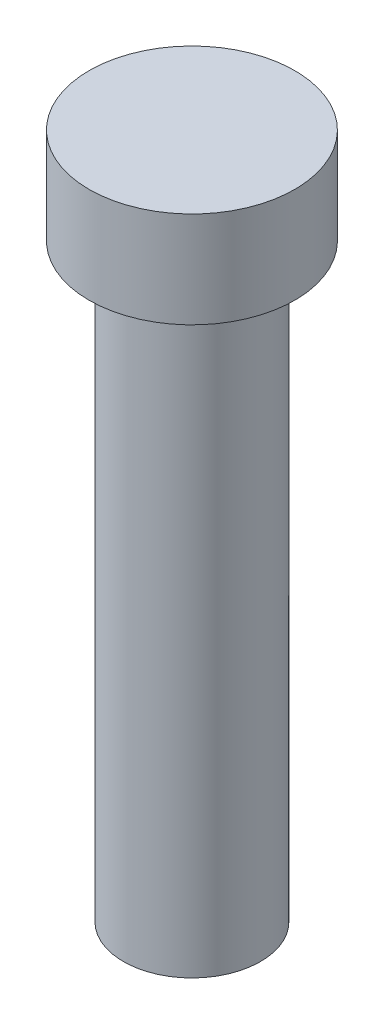
ISO-10303-21;
HEADER;
FILE_DESCRIPTION(('STEP AP214'),'2;1');
FILE_NAME('part.step','',(''),(''),'','','');
FILE_SCHEMA(('AUTOMOTIVE_DESIGN { 1 0 10303 214 1 1 1 1 }'));
ENDSEC;
DATA;
#1=APPLICATION_CONTEXT('core data for automotive mechanical design processes');
#2=APPLICATION_PROTOCOL_DEFINITION('international standard','automotive_design',2000,#1);
#3=PRODUCT_CONTEXT('',#1,'mechanical');
#4=PRODUCT('Part','Part','',(#3));
#5=PRODUCT_RELATED_PRODUCT_CATEGORY('part','',(#4));
#6=PRODUCT_DEFINITION_FORMATION('','',#4);
#7=PRODUCT_DEFINITION_CONTEXT('part definition',#1,'design');
#8=PRODUCT_DEFINITION('design','',#6,#7);
#9=PRODUCT_DEFINITION_SHAPE('','',#8);
#10=(LENGTH_UNIT() NAMED_UNIT(*) SI_UNIT(.MILLI.,.METRE.));
#11=(NAMED_UNIT(*) PLANE_ANGLE_UNIT() SI_UNIT($,.RADIAN.));
#12=(NAMED_UNIT(*) SI_UNIT($,.STERADIAN.) SOLID_ANGLE_UNIT());
#13=UNCERTAINTY_MEASURE_WITH_UNIT(LENGTH_MEASURE(1.E-05),#10,'distance_accuracy_value','');
#14=(GEOMETRIC_REPRESENTATION_CONTEXT(3) GLOBAL_UNCERTAINTY_ASSIGNED_CONTEXT((#13)) GLOBAL_UNIT_ASSIGNED_CONTEXT((#10,
#11,#12)) REPRESENTATION_CONTEXT('',''));
#15=CARTESIAN_POINT('',(0.,0.,0.));
#16=DIRECTION('',(0.,0.,1.));
#17=DIRECTION('',(1.,0.,0.));
#18=AXIS2_PLACEMENT_3D('',#15,#16,#17);
#19=CARTESIAN_POINT('',(0.,7.,0.));
#20=DIRECTION('',(0.,-1.,0.));
#21=DIRECTION('',(0.,0.,-1.));
#22=AXIS2_PLACEMENT_3D('',#19,#20,#21);
#23=CYLINDRICAL_SURFACE('',#22,7.5);
#24=CARTESIAN_POINT('',(0.,7.,0.));
#25=DIRECTION('',(0.,1.,0.));
#26=DIRECTION('',(0.,0.,1.));
#27=AXIS2_PLACEMENT_3D('',#24,#25,#26);
#28=CIRCLE('',#27,7.5);
#29=CARTESIAN_POINT('',(0.,7.,7.5));
#30=VERTEX_POINT('',#29);
#31=EDGE_CURVE('E44',#30,#30,#28,.T.);
#32=ORIENTED_EDGE('',*,*,#31,.F.);
#33=EDGE_LOOP('',(#32));
#34=FACE_BOUND('',#33,.T.);
#35=CARTESIAN_POINT('',(0.,0.,0.));
#36=DIRECTION('',(0.,1.,0.));
#37=DIRECTION('',(0.,0.,1.));
#38=AXIS2_PLACEMENT_3D('',#35,#36,#37);
#39=CIRCLE('',#38,7.5);
#40=CARTESIAN_POINT('',(0.,0.,7.5));
#41=VERTEX_POINT('',#40);
#42=EDGE_CURVE('E40',#41,#41,#39,.T.);
#43=ORIENTED_EDGE('',*,*,#42,.T.);
#44=EDGE_LOOP('',(#43));
#45=FACE_BOUND('',#44,.T.);
#46=ADVANCED_FACE('F37',(#34,#45),#23,.T.);
#47=CARTESIAN_POINT('',(0.,7.,0.));
#48=DIRECTION('',(0.,1.,0.));
#49=DIRECTION('',(0.,0.,1.));
#50=AXIS2_PLACEMENT_3D('',#47,#48,#49);
#51=PLANE('',#50);
#52=ORIENTED_EDGE('',*,*,#31,.T.);
#53=EDGE_LOOP('',(#52));
#54=FACE_BOUND('',#53,.T.);
#55=ADVANCED_FACE('F61',(#54),#51,.T.);
#56=CARTESIAN_POINT('',(0.,0.,0.));
#57=DIRECTION('',(0.,1.,0.));
#58=DIRECTION('',(0.,0.,1.));
#59=AXIS2_PLACEMENT_3D('',#56,#57,#58);
#60=PLANE('',#59);
#61=CARTESIAN_POINT('',(0.,0.,0.));
#62=DIRECTION('',(0.,-1.,0.));
#63=DIRECTION('',(0.,0.,-1.));
#64=AXIS2_PLACEMENT_3D('',#61,#62,#63);
#65=CIRCLE('',#64,5.);
#66=CARTESIAN_POINT('',(0.,0.,-5.));
#67=VERTEX_POINT('',#66);
#68=EDGE_CURVE('E10',#67,#67,#65,.T.);
#69=ORIENTED_EDGE('',*,*,#68,.F.);
#70=EDGE_LOOP('',(#69));
#71=FACE_BOUND('',#70,.T.);
#72=ORIENTED_EDGE('',*,*,#42,.F.);
#73=EDGE_LOOP('',(#72));
#74=FACE_BOUND('',#73,.T.);
#75=ADVANCED_FACE('F58',(#71,#74),#60,.F.);
#76=CARTESIAN_POINT('',(0.,-43.,0.));
#77=DIRECTION('',(0.,1.,0.));
#78=DIRECTION('',(0.,0.,1.));
#79=AXIS2_PLACEMENT_3D('',#76,#77,#78);
#80=CYLINDRICAL_SURFACE('',#79,5.);
#81=CARTESIAN_POINT('',(0.,-43.,0.));
#82=DIRECTION('',(0.,-1.,0.));
#83=DIRECTION('',(0.,0.,-1.));
#84=AXIS2_PLACEMENT_3D('',#81,#82,#83);
#85=CIRCLE('',#84,5.);
#86=CARTESIAN_POINT('',(0.,-43.,-5.));
#87=VERTEX_POINT('',#86);
#88=EDGE_CURVE('E50',#87,#87,#85,.T.);
#89=ORIENTED_EDGE('',*,*,#88,.F.);
#90=EDGE_LOOP('',(#89));
#91=FACE_BOUND('',#90,.T.);
#92=ORIENTED_EDGE('',*,*,#68,.T.);
#93=EDGE_LOOP('',(#92));
#94=FACE_BOUND('',#93,.T.);
#95=ADVANCED_FACE('F60',(#91,#94),#80,.T.);
#96=CARTESIAN_POINT('',(0.,-43.,0.));
#97=DIRECTION('',(0.,-1.,0.));
#98=DIRECTION('',(0.,0.,-1.));
#99=AXIS2_PLACEMENT_3D('',#96,#97,#98);
#100=PLANE('',#99);
#101=ORIENTED_EDGE('',*,*,#88,.T.);
#102=EDGE_LOOP('',(#101));
#103=FACE_BOUND('',#102,.T.);
#104=ADVANCED_FACE('F67',(#103),#100,.T.);
#105=CLOSED_SHELL('',(#46,#55,#75,#95,#104));
#106=MANIFOLD_SOLID_BREP('B2',#105);
#107=ADVANCED_BREP_SHAPE_REPRESENTATION('',(#18,#106),#14);
#108=SHAPE_DEFINITION_REPRESENTATION(#9,#107);
ENDSEC;
END-ISO-10303-21;
